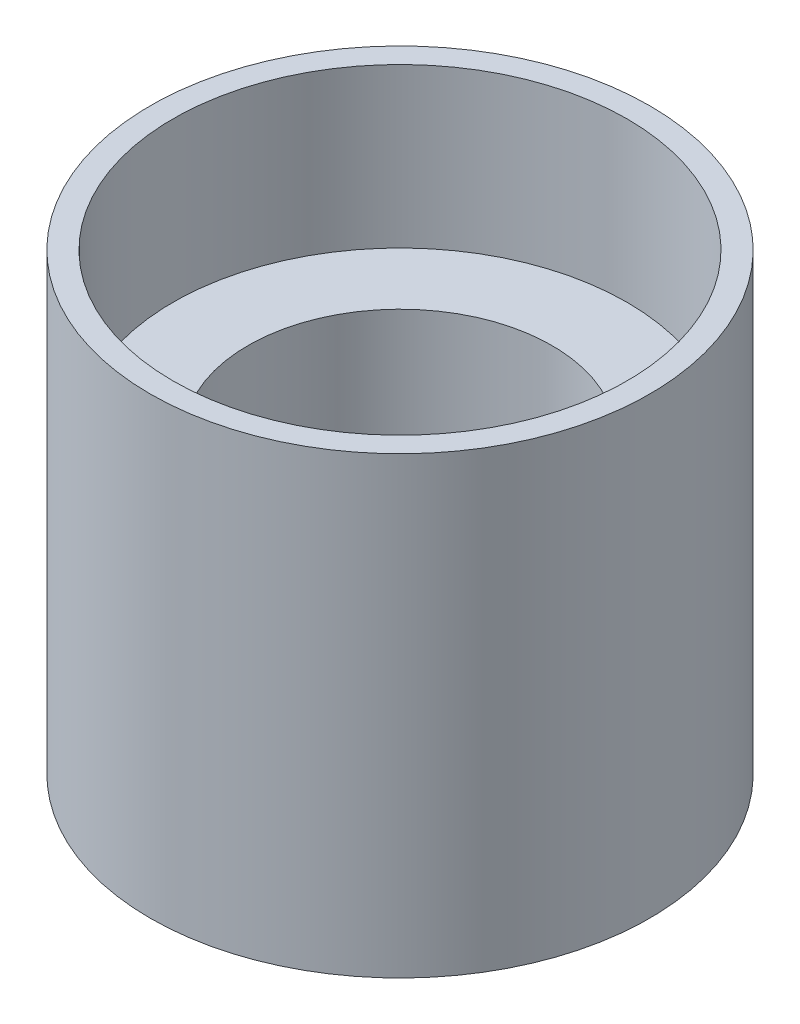
ISO-10303-21;
HEADER;
FILE_DESCRIPTION(('STEP AP214'),'2;1');
FILE_NAME('part.step','',(''),(''),'','','');
FILE_SCHEMA(('AUTOMOTIVE_DESIGN { 1 0 10303 214 1 1 1 1 }'));
ENDSEC;
DATA;
#1=APPLICATION_CONTEXT('core data for automotive mechanical design processes');
#2=APPLICATION_PROTOCOL_DEFINITION('international standard','automotive_design',2000,#1);
#3=PRODUCT_CONTEXT('',#1,'mechanical');
#4=PRODUCT('Part','Part','',(#3));
#5=PRODUCT_RELATED_PRODUCT_CATEGORY('part','',(#4));
#6=PRODUCT_DEFINITION_FORMATION('','',#4);
#7=PRODUCT_DEFINITION_CONTEXT('part definition',#1,'design');
#8=PRODUCT_DEFINITION('design','',#6,#7);
#9=PRODUCT_DEFINITION_SHAPE('','',#8);
#10=(LENGTH_UNIT() NAMED_UNIT(*) SI_UNIT(.MILLI.,.METRE.));
#11=(NAMED_UNIT(*) PLANE_ANGLE_UNIT() SI_UNIT($,.RADIAN.));
#12=(NAMED_UNIT(*) SI_UNIT($,.STERADIAN.) SOLID_ANGLE_UNIT());
#13=UNCERTAINTY_MEASURE_WITH_UNIT(LENGTH_MEASURE(1.E-05),#10,'distance_accuracy_value','');
#14=(GEOMETRIC_REPRESENTATION_CONTEXT(3) GLOBAL_UNCERTAINTY_ASSIGNED_CONTEXT((#13)) GLOBAL_UNIT_ASSIGNED_CONTEXT((#10,
#11,#12)) REPRESENTATION_CONTEXT('',''));
#15=CARTESIAN_POINT('',(0.,0.,0.));
#16=DIRECTION('',(0.,0.,1.));
#17=DIRECTION('',(1.,0.,0.));
#18=AXIS2_PLACEMENT_3D('',#15,#16,#17);
#19=CARTESIAN_POINT('',(0.,1.,0.));
#20=DIRECTION('',(0.,1.,0.));
#21=DIRECTION('',(0.,0.,1.));
#22=AXIS2_PLACEMENT_3D('',#19,#20,#21);
#23=CYLINDRICAL_SURFACE('',#22,6.7);
#24=CARTESIAN_POINT('',(0.,1.,0.));
#25=DIRECTION('',(0.,1.,0.));
#26=DIRECTION('',(0.,0.,1.));
#27=AXIS2_PLACEMENT_3D('',#24,#25,#26);
#28=CIRCLE('',#27,6.7);
#29=CARTESIAN_POINT('',(0.,1.,6.7));
#30=VERTEX_POINT('',#29);
#31=EDGE_CURVE('E59',#30,#30,#28,.T.);
#32=ORIENTED_EDGE('',*,*,#31,.F.);
#33=EDGE_LOOP('',(#32));
#34=FACE_BOUND('',#33,.T.);
#35=CARTESIAN_POINT('',(0.,13.,0.));
#36=DIRECTION('',(0.,1.,0.));
#37=DIRECTION('',(0.,0.,1.));
#38=AXIS2_PLACEMENT_3D('',#35,#36,#37);
#39=CIRCLE('',#38,6.7);
#40=CARTESIAN_POINT('',(0.,13.,6.7));
#41=VERTEX_POINT('',#40);
#42=EDGE_CURVE('E41',#41,#41,#39,.F.);
#43=ORIENTED_EDGE('',*,*,#42,.F.);
#44=EDGE_LOOP('',(#43));
#45=FACE_BOUND('',#44,.T.);
#46=ADVANCED_FACE('F37',(#34,#45),#23,.F.);
#47=CARTESIAN_POINT('',(0.,20.,0.));
#48=DIRECTION('',(0.,-1.,0.));
#49=DIRECTION('',(0.,0.,-1.));
#50=AXIS2_PLACEMENT_3D('',#47,#48,#49);
#51=CYLINDRICAL_SURFACE('',#50,3.25);
#52=CARTESIAN_POINT('',(0.,0.,0.));
#53=DIRECTION('',(0.,1.,0.));
#54=DIRECTION('',(0.,0.,1.));
#55=AXIS2_PLACEMENT_3D('',#52,#53,#54);
#56=CIRCLE('',#55,3.25);
#57=CARTESIAN_POINT('',(0.,0.,3.25));
#58=VERTEX_POINT('',#57);
#59=EDGE_CURVE('E52',#58,#58,#56,.T.);
#60=ORIENTED_EDGE('',*,*,#59,.F.);
#61=EDGE_LOOP('',(#60));
#62=FACE_BOUND('',#61,.T.);
#63=CARTESIAN_POINT('',(0.,1.,0.));
#64=DIRECTION('',(0.,1.,0.));
#65=DIRECTION('',(0.,0.,1.));
#66=AXIS2_PLACEMENT_3D('',#63,#64,#65);
#67=CIRCLE('',#66,3.25);
#68=CARTESIAN_POINT('',(0.,1.,3.25));
#69=VERTEX_POINT('',#68);
#70=EDGE_CURVE('E56',#69,#69,#67,.T.);
#71=ORIENTED_EDGE('',*,*,#70,.T.);
#72=EDGE_LOOP('',(#71));
#73=FACE_BOUND('',#72,.T.);
#74=ADVANCED_FACE('F99',(#62,#73),#51,.F.);
#75=CARTESIAN_POINT('',(0.,20.,0.));
#76=DIRECTION('',(0.,-1.,0.));
#77=DIRECTION('',(0.,0.,-1.));
#78=AXIS2_PLACEMENT_3D('',#75,#76,#77);
#79=CYLINDRICAL_SURFACE('',#78,11.);
#80=CARTESIAN_POINT('',(0.,20.,0.));
#81=DIRECTION('',(0.,1.,0.));
#82=DIRECTION('',(0.,0.,1.));
#83=AXIS2_PLACEMENT_3D('',#80,#81,#82);
#84=CIRCLE('',#83,11.);
#85=CARTESIAN_POINT('',(0.,20.,11.));
#86=VERTEX_POINT('',#85);
#87=EDGE_CURVE('E10',#86,#86,#84,.T.);
#88=ORIENTED_EDGE('',*,*,#87,.F.);
#89=EDGE_LOOP('',(#88));
#90=FACE_BOUND('',#89,.T.);
#91=CARTESIAN_POINT('',(0.,0.,0.));
#92=DIRECTION('',(0.,1.,0.));
#93=DIRECTION('',(0.,0.,1.));
#94=AXIS2_PLACEMENT_3D('',#91,#92,#93);
#95=CIRCLE('',#94,11.);
#96=CARTESIAN_POINT('',(0.,0.,11.));
#97=VERTEX_POINT('',#96);
#98=EDGE_CURVE('E46',#97,#97,#95,.T.);
#99=ORIENTED_EDGE('',*,*,#98,.T.);
#100=EDGE_LOOP('',(#99));
#101=FACE_BOUND('',#100,.T.);
#102=ADVANCED_FACE('F39',(#90,#101),#79,.T.);
#103=CARTESIAN_POINT('',(0.,20.,0.));
#104=DIRECTION('',(0.,1.,0.));
#105=DIRECTION('',(0.,0.,1.));
#106=AXIS2_PLACEMENT_3D('',#103,#104,#105);
#107=PLANE('',#106);
#108=CARTESIAN_POINT('',(0.,20.,0.));
#109=DIRECTION('',(0.,1.,0.));
#110=DIRECTION('',(0.,0.,1.));
#111=AXIS2_PLACEMENT_3D('',#108,#109,#110);
#112=CIRCLE('',#111,10.);
#113=CARTESIAN_POINT('',(0.,20.,10.));
#114=VERTEX_POINT('',#113);
#115=EDGE_CURVE('E72',#114,#114,#112,.T.);
#116=ORIENTED_EDGE('',*,*,#115,.F.);
#117=EDGE_LOOP('',(#116));
#118=FACE_BOUND('',#117,.T.);
#119=ORIENTED_EDGE('',*,*,#87,.T.);
#120=EDGE_LOOP('',(#119));
#121=FACE_BOUND('',#120,.T.);
#122=ADVANCED_FACE('F89',(#118,#121),#107,.T.);
#123=CARTESIAN_POINT('',(0.,0.,0.));
#124=DIRECTION('',(0.,1.,0.));
#125=DIRECTION('',(0.,0.,1.));
#126=AXIS2_PLACEMENT_3D('',#123,#124,#125);
#127=PLANE('',#126);
#128=ORIENTED_EDGE('',*,*,#59,.T.);
#129=EDGE_LOOP('',(#128));
#130=FACE_BOUND('',#129,.T.);
#131=ORIENTED_EDGE('',*,*,#98,.F.);
#132=EDGE_LOOP('',(#131));
#133=FACE_BOUND('',#132,.T.);
#134=ADVANCED_FACE('F91',(#130,#133),#127,.F.);
#135=CARTESIAN_POINT('',(0.,1.,0.));
#136=DIRECTION('',(0.,1.,0.));
#137=DIRECTION('',(0.,0.,1.));
#138=AXIS2_PLACEMENT_3D('',#135,#136,#137);
#139=PLANE('',#138);
#140=ORIENTED_EDGE('',*,*,#70,.F.);
#141=EDGE_LOOP('',(#140));
#142=FACE_BOUND('',#141,.T.);
#143=ORIENTED_EDGE('',*,*,#31,.T.);
#144=EDGE_LOOP('',(#143));
#145=FACE_BOUND('',#144,.T.);
#146=ADVANCED_FACE('F97',(#142,#145),#139,.T.);
#147=CARTESIAN_POINT('',(0.,13.,0.));
#148=DIRECTION('',(0.,1.,0.));
#149=DIRECTION('',(0.,0.,1.));
#150=AXIS2_PLACEMENT_3D('',#147,#148,#149);
#151=PLANE('',#150);
#152=CARTESIAN_POINT('',(0.,13.,0.));
#153=DIRECTION('',(0.,1.,0.));
#154=DIRECTION('',(0.,0.,1.));
#155=AXIS2_PLACEMENT_3D('',#152,#153,#154);
#156=CIRCLE('',#155,10.);
#157=CARTESIAN_POINT('',(0.,13.,10.));
#158=VERTEX_POINT('',#157);
#159=EDGE_CURVE('E70',#158,#158,#156,.T.);
#160=ORIENTED_EDGE('',*,*,#159,.T.);
#161=EDGE_LOOP('',(#160));
#162=FACE_BOUND('',#161,.T.);
#163=ORIENTED_EDGE('',*,*,#42,.T.);
#164=EDGE_LOOP('',(#163));
#165=FACE_BOUND('',#164,.T.);
#166=ADVANCED_FACE('F80',(#162,#165),#151,.T.);
#167=CARTESIAN_POINT('',(0.,13.,0.));
#168=DIRECTION('',(0.,1.,0.));
#169=DIRECTION('',(0.,0.,1.));
#170=AXIS2_PLACEMENT_3D('',#167,#168,#169);
#171=CYLINDRICAL_SURFACE('',#170,10.);
#172=ORIENTED_EDGE('',*,*,#159,.F.);
#173=EDGE_LOOP('',(#172));
#174=FACE_BOUND('',#173,.T.);
#175=ORIENTED_EDGE('',*,*,#115,.T.);
#176=EDGE_LOOP('',(#175));
#177=FACE_BOUND('',#176,.T.);
#178=ADVANCED_FACE('F83',(#174,#177),#171,.F.);
#179=CLOSED_SHELL('',(#46,#74,#102,#122,#134,#146,#166,#178));
#180=MANIFOLD_SOLID_BREP('B2',#179);
#181=ADVANCED_BREP_SHAPE_REPRESENTATION('',(#18,#180),#14);
#182=SHAPE_DEFINITION_REPRESENTATION(#9,#181);
ENDSEC;
END-ISO-10303-21;
